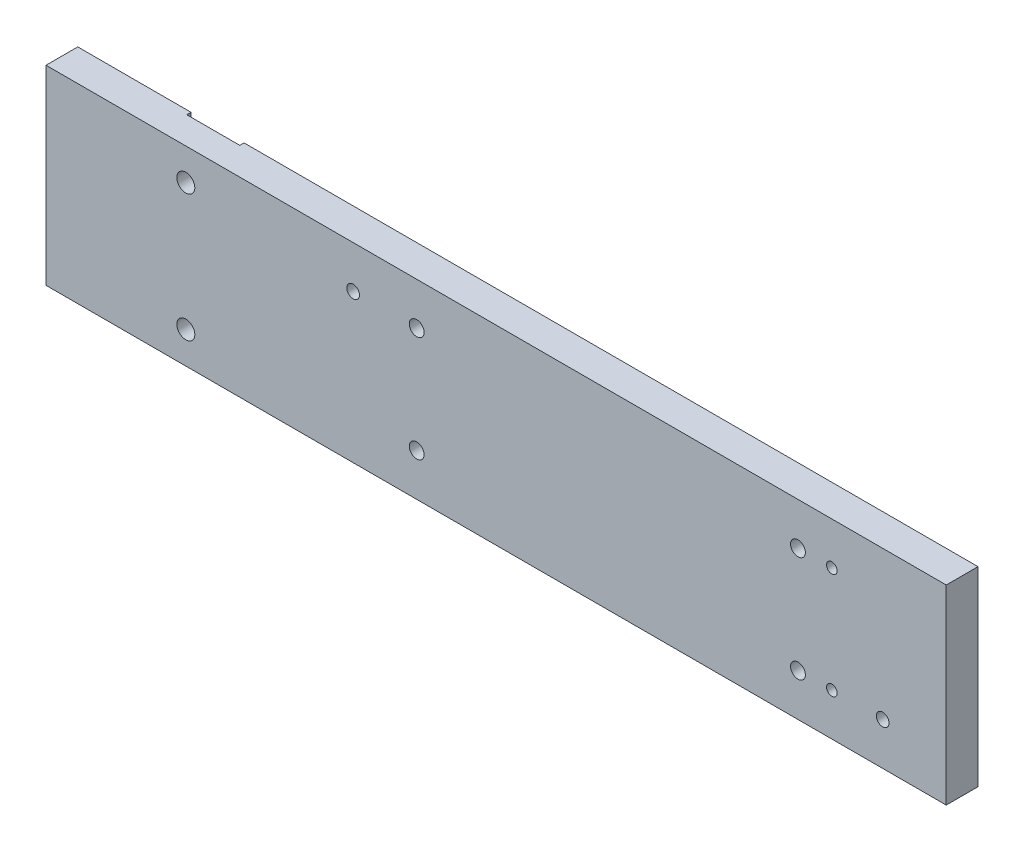
ISO-10303-21;
HEADER;
FILE_DESCRIPTION(('STEP AP214'),'2;1');
FILE_NAME('part.step','',(''),(''),'','','');
FILE_SCHEMA(('AUTOMOTIVE_DESIGN { 1 0 10303 214 1 1 1 1 }'));
ENDSEC;
DATA;
#1=APPLICATION_CONTEXT('core data for automotive mechanical design processes');
#2=APPLICATION_PROTOCOL_DEFINITION('international standard','automotive_design',2000,#1);
#3=PRODUCT_CONTEXT('',#1,'mechanical');
#4=PRODUCT('Part','Part','',(#3));
#5=PRODUCT_RELATED_PRODUCT_CATEGORY('part','',(#4));
#6=PRODUCT_DEFINITION_FORMATION('','',#4);
#7=PRODUCT_DEFINITION_CONTEXT('part definition',#1,'design');
#8=PRODUCT_DEFINITION('design','',#6,#7);
#9=PRODUCT_DEFINITION_SHAPE('','',#8);
#10=(LENGTH_UNIT() NAMED_UNIT(*) SI_UNIT(.MILLI.,.METRE.));
#11=(NAMED_UNIT(*) PLANE_ANGLE_UNIT() SI_UNIT($,.RADIAN.));
#12=(NAMED_UNIT(*) SI_UNIT($,.STERADIAN.) SOLID_ANGLE_UNIT());
#13=UNCERTAINTY_MEASURE_WITH_UNIT(LENGTH_MEASURE(1.E-05),#10,'distance_accuracy_value','');
#14=(GEOMETRIC_REPRESENTATION_CONTEXT(3) GLOBAL_UNCERTAINTY_ASSIGNED_CONTEXT((#13)) GLOBAL_UNIT_ASSIGNED_CONTEXT((#10,
#11,#12)) REPRESENTATION_CONTEXT('',''));
#15=CARTESIAN_POINT('',(0.,0.,0.));
#16=DIRECTION('',(0.,0.,1.));
#17=DIRECTION('',(1.,0.,0.));
#18=AXIS2_PLACEMENT_3D('',#15,#16,#17);
#19=CARTESIAN_POINT('',(0.,90.,0.));
#20=DIRECTION('',(0.,0.,-1.));
#21=DIRECTION('',(-1.,0.,0.));
#22=AXIS2_PLACEMENT_3D('',#19,#20,#21);
#23=PLANE('',#22);
#24=DIRECTION('',(0.,1.,0.));
#25=VECTOR('',#24,1.);
#26=CARTESIAN_POINT('',(53.5,0.,0.));
#27=LINE('',#26,#25);
#28=CARTESIAN_POINT('',(53.5,0.,0.));
#29=VERTEX_POINT('',#28);
#30=CARTESIAN_POINT('',(53.5,90.,0.));
#31=VERTEX_POINT('',#30);
#32=EDGE_CURVE('E183',#29,#31,#27,.T.);
#33=ORIENTED_EDGE('',*,*,#32,.F.);
#34=DIRECTION('',(1.,0.,0.));
#35=VECTOR('',#34,1.);
#36=CARTESIAN_POINT('',(0.,0.,0.));
#37=LINE('',#36,#35);
#38=CARTESIAN_POINT('',(0.,0.,0.));
#39=VERTEX_POINT('',#38);
#40=EDGE_CURVE('E202',#39,#29,#37,.T.);
#41=ORIENTED_EDGE('',*,*,#40,.F.);
#42=DIRECTION('',(0.,-1.,0.));
#43=VECTOR('',#42,1.);
#44=CARTESIAN_POINT('',(0.,0.,0.));
#45=LINE('',#44,#43);
#46=CARTESIAN_POINT('',(0.,90.,0.));
#47=VERTEX_POINT('',#46);
#48=EDGE_CURVE('E185',#47,#39,#45,.T.);
#49=ORIENTED_EDGE('',*,*,#48,.F.);
#50=DIRECTION('',(-1.,0.,0.));
#51=VECTOR('',#50,1.);
#52=CARTESIAN_POINT('',(0.,90.,0.));
#53=LINE('',#52,#51);
#54=EDGE_CURVE('E80',#31,#47,#53,.T.);
#55=ORIENTED_EDGE('',*,*,#54,.F.);
#56=EDGE_LOOP('',(#33,#41,#49,#55));
#57=FACE_BOUND('',#56,.T.);
#58=ADVANCED_FACE('F35',(#57),#23,.T.);
#59=CARTESIAN_POINT('',(0.,0.,15.));
#60=DIRECTION('',(1.,0.,0.));
#61=DIRECTION('',(0.,0.,-1.));
#62=AXIS2_PLACEMENT_3D('',#59,#60,#61);
#63=PLANE('',#62);
#64=CARTESIAN_POINT('',(0.,68.0000000000001,7.5));
#65=DIRECTION('',(-1.,0.,0.));
#66=DIRECTION('',(0.,0.,1.));
#67=AXIS2_PLACEMENT_3D('',#64,#65,#66);
#68=CIRCLE('',#67,2.5);
#69=CARTESIAN_POINT('',(0.,68.0000000000001,10.));
#70=VERTEX_POINT('',#69);
#71=EDGE_CURVE('E142',#70,#70,#68,.T.);
#72=ORIENTED_EDGE('',*,*,#71,.F.);
#73=EDGE_LOOP('',(#72));
#74=FACE_BOUND('',#73,.T.);
#75=CARTESIAN_POINT('',(0.,22.,7.50000000000002));
#76=DIRECTION('',(-1.,0.,0.));
#77=DIRECTION('',(0.,0.,1.));
#78=AXIS2_PLACEMENT_3D('',#75,#76,#77);
#79=CIRCLE('',#78,2.5);
#80=CARTESIAN_POINT('',(0.,22.,10.));
#81=VERTEX_POINT('',#80);
#82=EDGE_CURVE('E148',#81,#81,#79,.T.);
#83=ORIENTED_EDGE('',*,*,#82,.F.);
#84=EDGE_LOOP('',(#83));
#85=FACE_BOUND('',#84,.T.);
#86=ORIENTED_EDGE('',*,*,#48,.T.);
#87=DIRECTION('',(0.,0.,-1.));
#88=VECTOR('',#87,1.);
#89=CARTESIAN_POINT('',(0.,0.,15.));
#90=LINE('',#89,#88);
#91=CARTESIAN_POINT('',(0.,0.,15.));
#92=VERTEX_POINT('',#91);
#93=EDGE_CURVE('E11',#92,#39,#90,.T.);
#94=ORIENTED_EDGE('',*,*,#93,.F.);
#95=DIRECTION('',(0.,-1.,0.));
#96=VECTOR('',#95,1.);
#97=CARTESIAN_POINT('',(0.,0.,15.));
#98=LINE('',#97,#96);
#99=CARTESIAN_POINT('',(0.,90.,15.));
#100=VERTEX_POINT('',#99);
#101=EDGE_CURVE('E191',#100,#92,#98,.T.);
#102=ORIENTED_EDGE('',*,*,#101,.F.);
#103=DIRECTION('',(0.,0.,-1.));
#104=VECTOR('',#103,1.);
#105=CARTESIAN_POINT('',(0.,90.,15.));
#106=LINE('',#105,#104);
#107=EDGE_CURVE('E198',#100,#47,#106,.T.);
#108=ORIENTED_EDGE('',*,*,#107,.T.);
#109=EDGE_LOOP('',(#86,#94,#102,#108));
#110=FACE_BOUND('',#109,.T.);
#111=ADVANCED_FACE('F37',(#74,#85,#110),#63,.F.);
#112=CARTESIAN_POINT('',(0.,0.,15.));
#113=DIRECTION('',(0.,1.,0.));
#114=DIRECTION('',(0.,0.,1.));
#115=AXIS2_PLACEMENT_3D('',#112,#113,#114);
#116=PLANE('',#115);
#117=CARTESIAN_POINT('',(8.99999999999905,0.,8.00000000000002));
#118=DIRECTION('',(0.,-1.,0.));
#119=DIRECTION('',(0.,0.,-1.));
#120=AXIS2_PLACEMENT_3D('',#117,#118,#119);
#121=CIRCLE('',#120,2.1);
#122=CARTESIAN_POINT('',(8.99999999999905,0.,5.90000000000002));
#123=VERTEX_POINT('',#122);
#124=EDGE_CURVE('E130',#123,#123,#121,.T.);
#125=ORIENTED_EDGE('',*,*,#124,.F.);
#126=EDGE_LOOP('',(#125));
#127=FACE_BOUND('',#126,.T.);
#128=CARTESIAN_POINT('',(43.9999999999991,0.,8.00000000000001));
#129=DIRECTION('',(0.,-1.,0.));
#130=DIRECTION('',(0.,0.,-1.));
#131=AXIS2_PLACEMENT_3D('',#128,#129,#130);
#132=CIRCLE('',#131,2.1);
#133=CARTESIAN_POINT('',(43.9999999999991,0.,5.90000000000002));
#134=VERTEX_POINT('',#133);
#135=EDGE_CURVE('E129',#134,#134,#132,.T.);
#136=ORIENTED_EDGE('',*,*,#135,.F.);
#137=EDGE_LOOP('',(#136));
#138=FACE_BOUND('',#137,.T.);
#139=ORIENTED_EDGE('',*,*,#40,.T.);
#140=DIRECTION('',(0.,0.,1.));
#141=VECTOR('',#140,1.);
#142=CARTESIAN_POINT('',(53.5,0.,0.));
#143=LINE('',#142,#141);
#144=CARTESIAN_POINT('',(53.5,0.,2.));
#145=VERTEX_POINT('',#144);
#146=EDGE_CURVE('E167',#29,#145,#143,.T.);
#147=ORIENTED_EDGE('',*,*,#146,.T.);
#148=DIRECTION('',(1.,0.,0.));
#149=VECTOR('',#148,1.);
#150=CARTESIAN_POINT('',(53.5,0.,2.));
#151=LINE('',#150,#149);
#152=CARTESIAN_POINT('',(78.5,0.,2.));
#153=VERTEX_POINT('',#152);
#154=EDGE_CURVE('E170',#145,#153,#151,.T.);
#155=ORIENTED_EDGE('',*,*,#154,.T.);
#156=DIRECTION('',(0.,0.,-1.));
#157=VECTOR('',#156,1.);
#158=CARTESIAN_POINT('',(78.5,0.,0.));
#159=LINE('',#158,#157);
#160=CARTESIAN_POINT('',(78.5,0.,0.));
#161=VERTEX_POINT('',#160);
#162=EDGE_CURVE('E173',#153,#161,#159,.T.);
#163=ORIENTED_EDGE('',*,*,#162,.T.);
#164=CARTESIAN_POINT('',(425.,0.,0.));
#165=VERTEX_POINT('',#164);
#166=EDGE_CURVE('E201',#161,#165,#37,.T.);
#167=ORIENTED_EDGE('',*,*,#166,.T.);
#168=DIRECTION('',(0.,0.,-1.));
#169=VECTOR('',#168,1.);
#170=CARTESIAN_POINT('',(425.,0.,15.));
#171=LINE('',#170,#169);
#172=CARTESIAN_POINT('',(425.,0.,15.));
#173=VERTEX_POINT('',#172);
#174=EDGE_CURVE('E43',#173,#165,#171,.T.);
#175=ORIENTED_EDGE('',*,*,#174,.F.);
#176=DIRECTION('',(1.,0.,0.));
#177=VECTOR('',#176,1.);
#178=CARTESIAN_POINT('',(0.,0.,15.));
#179=LINE('',#178,#177);
#180=EDGE_CURVE('E87',#92,#173,#179,.T.);
#181=ORIENTED_EDGE('',*,*,#180,.F.);
#182=ORIENTED_EDGE('',*,*,#93,.T.);
#183=EDGE_LOOP('',(#139,#147,#155,#163,#167,#175,#181,#182));
#184=FACE_BOUND('',#183,.T.);
#185=ADVANCED_FACE('F250',(#127,#138,#184),#116,.F.);
#186=CARTESIAN_POINT('',(425.,0.,15.));
#187=DIRECTION('',(-1.,0.,0.));
#188=DIRECTION('',(0.,0.,1.));
#189=AXIS2_PLACEMENT_3D('',#186,#187,#188);
#190=PLANE('',#189);
#191=DIRECTION('',(0.,1.,0.));
#192=VECTOR('',#191,1.);
#193=CARTESIAN_POINT('',(425.,0.,0.));
#194=LINE('',#193,#192);
#195=CARTESIAN_POINT('',(425.,90.,0.));
#196=VERTEX_POINT('',#195);
#197=EDGE_CURVE('E205',#165,#196,#194,.T.);
#198=ORIENTED_EDGE('',*,*,#197,.T.);
#199=DIRECTION('',(0.,0.,-1.));
#200=VECTOR('',#199,1.);
#201=CARTESIAN_POINT('',(425.,90.,15.));
#202=LINE('',#201,#200);
#203=CARTESIAN_POINT('',(425.,90.,15.));
#204=VERTEX_POINT('',#203);
#205=EDGE_CURVE('E210',#204,#196,#202,.T.);
#206=ORIENTED_EDGE('',*,*,#205,.F.);
#207=DIRECTION('',(0.,1.,0.));
#208=VECTOR('',#207,1.);
#209=CARTESIAN_POINT('',(425.,0.,15.));
#210=LINE('',#209,#208);
#211=EDGE_CURVE('E195',#173,#204,#210,.T.);
#212=ORIENTED_EDGE('',*,*,#211,.F.);
#213=ORIENTED_EDGE('',*,*,#174,.T.);
#214=EDGE_LOOP('',(#198,#206,#212,#213));
#215=FACE_BOUND('',#214,.T.);
#216=ADVANCED_FACE('F216',(#215),#190,.F.);
#217=CARTESIAN_POINT('',(0.,90.,15.));
#218=DIRECTION('',(0.,-1.,0.));
#219=DIRECTION('',(0.,0.,-1.));
#220=AXIS2_PLACEMENT_3D('',#217,#218,#219);
#221=PLANE('',#220);
#222=DIRECTION('',(1.,0.,0.));
#223=VECTOR('',#222,1.);
#224=CARTESIAN_POINT('',(53.5,90.,2.));
#225=LINE('',#224,#223);
#226=CARTESIAN_POINT('',(53.5,90.,2.));
#227=VERTEX_POINT('',#226);
#228=CARTESIAN_POINT('',(78.5,90.,2.));
#229=VERTEX_POINT('',#228);
#230=EDGE_CURVE('E179',#227,#229,#225,.T.);
#231=ORIENTED_EDGE('',*,*,#230,.F.);
#232=DIRECTION('',(0.,0.,1.));
#233=VECTOR('',#232,1.);
#234=CARTESIAN_POINT('',(53.5,90.,0.));
#235=LINE('',#234,#233);
#236=EDGE_CURVE('E166',#31,#227,#235,.T.);
#237=ORIENTED_EDGE('',*,*,#236,.F.);
#238=ORIENTED_EDGE('',*,*,#54,.T.);
#239=ORIENTED_EDGE('',*,*,#107,.F.);
#240=DIRECTION('',(-1.,0.,0.));
#241=VECTOR('',#240,1.);
#242=CARTESIAN_POINT('',(0.,90.,15.));
#243=LINE('',#242,#241);
#244=EDGE_CURVE('E59',#204,#100,#243,.T.);
#245=ORIENTED_EDGE('',*,*,#244,.F.);
#246=ORIENTED_EDGE('',*,*,#205,.T.);
#247=CARTESIAN_POINT('',(78.5,90.,0.));
#248=VERTEX_POINT('',#247);
#249=EDGE_CURVE('E193',#196,#248,#53,.T.);
#250=ORIENTED_EDGE('',*,*,#249,.T.);
#251=DIRECTION('',(0.,0.,-1.));
#252=VECTOR('',#251,1.);
#253=CARTESIAN_POINT('',(78.5,90.,0.));
#254=LINE('',#253,#252);
#255=EDGE_CURVE('E50',#229,#248,#254,.T.);
#256=ORIENTED_EDGE('',*,*,#255,.F.);
#257=EDGE_LOOP('',(#231,#237,#238,#239,#245,#246,#250,#256));
#258=FACE_BOUND('',#257,.T.);
#259=ADVANCED_FACE('F223',(#258),#221,.F.);
#260=CARTESIAN_POINT('',(0.,90.,15.));
#261=DIRECTION('',(0.,0.,-1.));
#262=DIRECTION('',(-1.,0.,0.));
#263=AXIS2_PLACEMENT_3D('',#260,#261,#262);
#264=PLANE('',#263);
#265=CARTESIAN_POINT('',(175.,20.,15.));
#266=DIRECTION('',(0.,0.,-1.));
#267=DIRECTION('',(-1.,0.,0.));
#268=AXIS2_PLACEMENT_3D('',#265,#266,#267);
#269=CIRCLE('',#268,3.5);
#270=CARTESIAN_POINT('',(171.5,20.,15.));
#271=VERTEX_POINT('',#270);
#272=EDGE_CURVE('E391',#271,#271,#269,.T.);
#273=ORIENTED_EDGE('',*,*,#272,.T.);
#274=EDGE_LOOP('',(#273));
#275=FACE_BOUND('',#274,.T.);
#276=CARTESIAN_POINT('',(355.,20.,15.));
#277=DIRECTION('',(0.,0.,-1.));
#278=DIRECTION('',(-1.,0.,0.));
#279=AXIS2_PLACEMENT_3D('',#276,#277,#278);
#280=CIRCLE('',#279,3.5);
#281=CARTESIAN_POINT('',(351.5,20.,15.));
#282=VERTEX_POINT('',#281);
#283=EDGE_CURVE('E402',#282,#282,#280,.T.);
#284=ORIENTED_EDGE('',*,*,#283,.T.);
#285=EDGE_LOOP('',(#284));
#286=FACE_BOUND('',#285,.T.);
#287=CARTESIAN_POINT('',(175.,70.,15.));
#288=DIRECTION('',(0.,0.,-1.));
#289=DIRECTION('',(-1.,0.,0.));
#290=AXIS2_PLACEMENT_3D('',#287,#288,#289);
#291=CIRCLE('',#290,3.5);
#292=CARTESIAN_POINT('',(171.5,70.,15.));
#293=VERTEX_POINT('',#292);
#294=EDGE_CURVE('E414',#293,#293,#291,.T.);
#295=ORIENTED_EDGE('',*,*,#294,.T.);
#296=EDGE_LOOP('',(#295));
#297=FACE_BOUND('',#296,.T.);
#298=CARTESIAN_POINT('',(355.,70.,15.));
#299=DIRECTION('',(0.,0.,-1.));
#300=DIRECTION('',(-1.,0.,0.));
#301=AXIS2_PLACEMENT_3D('',#298,#299,#300);
#302=CIRCLE('',#301,3.5);
#303=CARTESIAN_POINT('',(351.5,70.,15.));
#304=VERTEX_POINT('',#303);
#305=EDGE_CURVE('E426',#304,#304,#302,.T.);
#306=ORIENTED_EDGE('',*,*,#305,.T.);
#307=EDGE_LOOP('',(#306));
#308=FACE_BOUND('',#307,.T.);
#309=CARTESIAN_POINT('',(395.,20.,15.));
#310=DIRECTION('',(0.,0.,-1.));
#311=DIRECTION('',(-1.,0.,0.));
#312=AXIS2_PLACEMENT_3D('',#309,#310,#311);
#313=CIRCLE('',#312,2.99999999999999);
#314=CARTESIAN_POINT('',(392.,20.,15.));
#315=VERTEX_POINT('',#314);
#316=EDGE_CURVE('E430',#315,#315,#313,.T.);
#317=ORIENTED_EDGE('',*,*,#316,.T.);
#318=EDGE_LOOP('',(#317));
#319=FACE_BOUND('',#318,.T.);
#320=CARTESIAN_POINT('',(145.,70.,15.));
#321=DIRECTION('',(0.,0.,-1.));
#322=DIRECTION('',(-1.,0.,0.));
#323=AXIS2_PLACEMENT_3D('',#320,#321,#322);
#324=CIRCLE('',#323,2.99999999999999);
#325=CARTESIAN_POINT('',(142.,70.,15.));
#326=VERTEX_POINT('',#325);
#327=EDGE_CURVE('E436',#326,#326,#324,.T.);
#328=ORIENTED_EDGE('',*,*,#327,.T.);
#329=EDGE_LOOP('',(#328));
#330=FACE_BOUND('',#329,.T.);
#331=CARTESIAN_POINT('',(371.,70.,15.));
#332=DIRECTION('',(0.,0.,-1.));
#333=DIRECTION('',(-1.,0.,0.));
#334=AXIS2_PLACEMENT_3D('',#331,#332,#333);
#335=CIRCLE('',#334,2.5);
#336=CARTESIAN_POINT('',(368.5,70.,15.));
#337=VERTEX_POINT('',#336);
#338=EDGE_CURVE('E444',#337,#337,#335,.T.);
#339=ORIENTED_EDGE('',*,*,#338,.T.);
#340=EDGE_LOOP('',(#339));
#341=FACE_BOUND('',#340,.T.);
#342=CARTESIAN_POINT('',(371.,20.,15.));
#343=DIRECTION('',(0.,0.,-1.));
#344=DIRECTION('',(-1.,0.,0.));
#345=AXIS2_PLACEMENT_3D('',#342,#343,#344);
#346=CIRCLE('',#345,2.5);
#347=CARTESIAN_POINT('',(368.5,20.,15.));
#348=VERTEX_POINT('',#347);
#349=EDGE_CURVE('E136',#348,#348,#346,.T.);
#350=ORIENTED_EDGE('',*,*,#349,.T.);
#351=EDGE_LOOP('',(#350));
#352=FACE_BOUND('',#351,.T.);
#353=CARTESIAN_POINT('',(65.9999999999998,75.,15.));
#354=DIRECTION('',(0.,0.,-1.));
#355=DIRECTION('',(-1.,0.,0.));
#356=AXIS2_PLACEMENT_3D('',#353,#354,#355);
#357=CIRCLE('',#356,4.25);
#358=CARTESIAN_POINT('',(61.7499999999998,75.,15.));
#359=VERTEX_POINT('',#358);
#360=EDGE_CURVE('E157',#359,#359,#357,.T.);
#361=ORIENTED_EDGE('',*,*,#360,.T.);
#362=EDGE_LOOP('',(#361));
#363=FACE_BOUND('',#362,.T.);
#364=CARTESIAN_POINT('',(65.9999999999998,14.9999999999999,15.));
#365=DIRECTION('',(0.,0.,-1.));
#366=DIRECTION('',(-1.,0.,0.));
#367=AXIS2_PLACEMENT_3D('',#364,#365,#366);
#368=CIRCLE('',#367,4.25);
#369=CARTESIAN_POINT('',(61.7499999999998,14.9999999999999,15.));
#370=VERTEX_POINT('',#369);
#371=EDGE_CURVE('E163',#370,#370,#368,.T.);
#372=ORIENTED_EDGE('',*,*,#371,.T.);
#373=EDGE_LOOP('',(#372));
#374=FACE_BOUND('',#373,.T.);
#375=ORIENTED_EDGE('',*,*,#101,.T.);
#376=ORIENTED_EDGE('',*,*,#180,.T.);
#377=ORIENTED_EDGE('',*,*,#211,.T.);
#378=ORIENTED_EDGE('',*,*,#244,.T.);
#379=EDGE_LOOP('',(#375,#376,#377,#378));
#380=FACE_BOUND('',#379,.T.);
#381=ADVANCED_FACE('F228',(#275,#286,#297,#308,#319,#330,#341,#352,#363,#374,#380),#264,.F.);
#382=CARTESIAN_POINT('',(175.,20.,0.));
#383=DIRECTION('',(0.,0.,-1.));
#384=DIRECTION('',(-1.,0.,0.));
#385=AXIS2_PLACEMENT_3D('',#382,#383,#384);
#386=CIRCLE('',#385,5.50000000000001);
#387=CARTESIAN_POINT('',(169.5,20.,0.));
#388=VERTEX_POINT('',#387);
#389=EDGE_CURVE('E384',#388,#388,#386,.T.);
#390=ORIENTED_EDGE('',*,*,#389,.F.);
#391=EDGE_LOOP('',(#390));
#392=FACE_BOUND('',#391,.T.);
#393=CARTESIAN_POINT('',(355.,20.,0.));
#394=DIRECTION('',(0.,0.,-1.));
#395=DIRECTION('',(-1.,0.,0.));
#396=AXIS2_PLACEMENT_3D('',#393,#394,#395);
#397=CIRCLE('',#396,5.50000000000001);
#398=CARTESIAN_POINT('',(349.5,20.,0.));
#399=VERTEX_POINT('',#398);
#400=EDGE_CURVE('E393',#399,#399,#397,.T.);
#401=ORIENTED_EDGE('',*,*,#400,.F.);
#402=EDGE_LOOP('',(#401));
#403=FACE_BOUND('',#402,.T.);
#404=CARTESIAN_POINT('',(175.,70.,0.));
#405=DIRECTION('',(0.,0.,-1.));
#406=DIRECTION('',(-1.,0.,0.));
#407=AXIS2_PLACEMENT_3D('',#404,#405,#406);
#408=CIRCLE('',#407,5.50000000000001);
#409=CARTESIAN_POINT('',(169.5,70.,0.));
#410=VERTEX_POINT('',#409);
#411=EDGE_CURVE('E405',#410,#410,#408,.T.);
#412=ORIENTED_EDGE('',*,*,#411,.F.);
#413=EDGE_LOOP('',(#412));
#414=FACE_BOUND('',#413,.T.);
#415=CARTESIAN_POINT('',(355.,70.,0.));
#416=DIRECTION('',(0.,0.,-1.));
#417=DIRECTION('',(-1.,0.,0.));
#418=AXIS2_PLACEMENT_3D('',#415,#416,#417);
#419=CIRCLE('',#418,5.50000000000001);
#420=CARTESIAN_POINT('',(349.5,70.,0.));
#421=VERTEX_POINT('',#420);
#422=EDGE_CURVE('E417',#421,#421,#419,.T.);
#423=ORIENTED_EDGE('',*,*,#422,.F.);
#424=EDGE_LOOP('',(#423));
#425=FACE_BOUND('',#424,.T.);
#426=CARTESIAN_POINT('',(395.,20.,0.));
#427=DIRECTION('',(0.,0.,-1.));
#428=DIRECTION('',(-1.,0.,0.));
#429=AXIS2_PLACEMENT_3D('',#426,#427,#428);
#430=CIRCLE('',#429,2.99999999999999);
#431=CARTESIAN_POINT('',(392.,20.,0.));
#432=VERTEX_POINT('',#431);
#433=EDGE_CURVE('E429',#432,#432,#430,.T.);
#434=ORIENTED_EDGE('',*,*,#433,.F.);
#435=EDGE_LOOP('',(#434));
#436=FACE_BOUND('',#435,.T.);
#437=CARTESIAN_POINT('',(145.,70.,0.));
#438=DIRECTION('',(0.,0.,-1.));
#439=DIRECTION('',(-1.,0.,0.));
#440=AXIS2_PLACEMENT_3D('',#437,#438,#439);
#441=CIRCLE('',#440,2.99999999999999);
#442=CARTESIAN_POINT('',(142.,70.,0.));
#443=VERTEX_POINT('',#442);
#444=EDGE_CURVE('E433',#443,#443,#441,.T.);
#445=ORIENTED_EDGE('',*,*,#444,.F.);
#446=EDGE_LOOP('',(#445));
#447=FACE_BOUND('',#446,.T.);
#448=CARTESIAN_POINT('',(371.,70.,0.));
#449=DIRECTION('',(0.,0.,-1.));
#450=DIRECTION('',(-1.,0.,0.));
#451=AXIS2_PLACEMENT_3D('',#448,#449,#450);
#452=CIRCLE('',#451,2.5);
#453=CARTESIAN_POINT('',(368.5,70.,0.));
#454=VERTEX_POINT('',#453);
#455=EDGE_CURVE('E439',#454,#454,#452,.T.);
#456=ORIENTED_EDGE('',*,*,#455,.F.);
#457=EDGE_LOOP('',(#456));
#458=FACE_BOUND('',#457,.T.);
#459=CARTESIAN_POINT('',(371.,20.,0.));
#460=DIRECTION('',(0.,0.,-1.));
#461=DIRECTION('',(-1.,0.,0.));
#462=AXIS2_PLACEMENT_3D('',#459,#460,#461);
#463=CIRCLE('',#462,2.5);
#464=CARTESIAN_POINT('',(368.5,20.,0.));
#465=VERTEX_POINT('',#464);
#466=EDGE_CURVE('E447',#465,#465,#463,.T.);
#467=ORIENTED_EDGE('',*,*,#466,.F.);
#468=EDGE_LOOP('',(#467));
#469=FACE_BOUND('',#468,.T.);
#470=DIRECTION('',(0.,1.,0.));
#471=VECTOR('',#470,1.);
#472=CARTESIAN_POINT('',(78.5,0.,0.));
#473=LINE('',#472,#471);
#474=EDGE_CURVE('E186',#161,#248,#473,.T.);
#475=ORIENTED_EDGE('',*,*,#474,.T.);
#476=ORIENTED_EDGE('',*,*,#249,.F.);
#477=ORIENTED_EDGE('',*,*,#197,.F.);
#478=ORIENTED_EDGE('',*,*,#166,.F.);
#479=EDGE_LOOP('',(#475,#476,#477,#478));
#480=FACE_BOUND('',#479,.T.);
#481=ADVANCED_FACE('F221',(#392,#403,#414,#425,#436,#447,#458,#469,#480),#23,.T.);
#482=CARTESIAN_POINT('',(53.5,0.,0.));
#483=DIRECTION('',(-1.,0.,0.));
#484=DIRECTION('',(0.,0.,1.));
#485=AXIS2_PLACEMENT_3D('',#482,#483,#484);
#486=PLANE('',#485);
#487=ORIENTED_EDGE('',*,*,#236,.T.);
#488=DIRECTION('',(0.,1.,0.));
#489=VECTOR('',#488,1.);
#490=CARTESIAN_POINT('',(53.5,0.,2.));
#491=LINE('',#490,#489);
#492=EDGE_CURVE('E176',#145,#227,#491,.T.);
#493=ORIENTED_EDGE('',*,*,#492,.F.);
#494=ORIENTED_EDGE('',*,*,#146,.F.);
#495=ORIENTED_EDGE('',*,*,#32,.T.);
#496=EDGE_LOOP('',(#487,#493,#494,#495));
#497=FACE_BOUND('',#496,.T.);
#498=ADVANCED_FACE('F236',(#497),#486,.F.);
#499=CARTESIAN_POINT('',(78.5,0.,0.));
#500=DIRECTION('',(1.,0.,0.));
#501=DIRECTION('',(0.,0.,-1.));
#502=AXIS2_PLACEMENT_3D('',#499,#500,#501);
#503=PLANE('',#502);
#504=ORIENTED_EDGE('',*,*,#255,.T.);
#505=ORIENTED_EDGE('',*,*,#474,.F.);
#506=ORIENTED_EDGE('',*,*,#162,.F.);
#507=DIRECTION('',(0.,1.,0.));
#508=VECTOR('',#507,1.);
#509=CARTESIAN_POINT('',(78.5,0.,2.));
#510=LINE('',#509,#508);
#511=EDGE_CURVE('E188',#153,#229,#510,.T.);
#512=ORIENTED_EDGE('',*,*,#511,.T.);
#513=EDGE_LOOP('',(#504,#505,#506,#512));
#514=FACE_BOUND('',#513,.T.);
#515=ADVANCED_FACE('F269',(#514),#503,.F.);
#516=CARTESIAN_POINT('',(53.5,0.,2.));
#517=DIRECTION('',(0.,0.,1.));
#518=DIRECTION('',(1.,0.,0.));
#519=AXIS2_PLACEMENT_3D('',#516,#517,#518);
#520=PLANE('',#519);
#521=CARTESIAN_POINT('',(65.9999999999998,75.,2.));
#522=DIRECTION('',(0.,0.,-1.));
#523=DIRECTION('',(-1.,0.,0.));
#524=AXIS2_PLACEMENT_3D('',#521,#522,#523);
#525=CIRCLE('',#524,4.25);
#526=CARTESIAN_POINT('',(61.7499999999998,75.,2.));
#527=VERTEX_POINT('',#526);
#528=EDGE_CURVE('E154',#527,#527,#525,.T.);
#529=ORIENTED_EDGE('',*,*,#528,.F.);
#530=EDGE_LOOP('',(#529));
#531=FACE_BOUND('',#530,.T.);
#532=CARTESIAN_POINT('',(65.9999999999998,14.9999999999999,2.));
#533=DIRECTION('',(0.,0.,-1.));
#534=DIRECTION('',(-1.,0.,0.));
#535=AXIS2_PLACEMENT_3D('',#532,#533,#534);
#536=CIRCLE('',#535,4.25);
#537=CARTESIAN_POINT('',(61.7499999999998,14.9999999999999,2.));
#538=VERTEX_POINT('',#537);
#539=EDGE_CURVE('E160',#538,#538,#536,.T.);
#540=ORIENTED_EDGE('',*,*,#539,.F.);
#541=EDGE_LOOP('',(#540));
#542=FACE_BOUND('',#541,.T.);
#543=ORIENTED_EDGE('',*,*,#230,.T.);
#544=ORIENTED_EDGE('',*,*,#511,.F.);
#545=ORIENTED_EDGE('',*,*,#154,.F.);
#546=ORIENTED_EDGE('',*,*,#492,.T.);
#547=EDGE_LOOP('',(#543,#544,#545,#546));
#548=FACE_BOUND('',#547,.T.);
#549=ADVANCED_FACE('F266',(#531,#542,#548),#520,.F.);
#550=CARTESIAN_POINT('',(65.9999999999998,14.9999999999999,2.));
#551=DIRECTION('',(0.,0.,-1.));
#552=DIRECTION('',(-1.,0.,0.));
#553=AXIS2_PLACEMENT_3D('',#550,#551,#552);
#554=CYLINDRICAL_SURFACE('',#553,4.25);
#555=ORIENTED_EDGE('',*,*,#539,.T.);
#556=EDGE_LOOP('',(#555));
#557=FACE_BOUND('',#556,.T.);
#558=ORIENTED_EDGE('',*,*,#371,.F.);
#559=EDGE_LOOP('',(#558));
#560=FACE_BOUND('',#559,.T.);
#561=ADVANCED_FACE('F277',(#557,#560),#554,.F.);
#562=CARTESIAN_POINT('',(65.9999999999998,75.,2.));
#563=DIRECTION('',(0.,0.,-1.));
#564=DIRECTION('',(-1.,0.,0.));
#565=AXIS2_PLACEMENT_3D('',#562,#563,#564);
#566=CYLINDRICAL_SURFACE('',#565,4.25);
#567=ORIENTED_EDGE('',*,*,#528,.T.);
#568=EDGE_LOOP('',(#567));
#569=FACE_BOUND('',#568,.T.);
#570=ORIENTED_EDGE('',*,*,#360,.F.);
#571=EDGE_LOOP('',(#570));
#572=FACE_BOUND('',#571,.T.);
#573=ADVANCED_FACE('F283',(#569,#572),#566,.F.);
#574=CARTESIAN_POINT('',(15.,22.,7.50000000000002));
#575=DIRECTION('',(-1.,0.,0.));
#576=DIRECTION('',(0.,0.,1.));
#577=AXIS2_PLACEMENT_3D('',#574,#575,#576);
#578=CONICAL_SURFACE('',#577,2.5,1.02974425867665);
#579=CARTESIAN_POINT('',(16.5021515475689,22.,7.50000000000002));
#580=VERTEX_POINT('',#579);
#581=VERTEX_LOOP('',#580);
#582=FACE_BOUND('',#581,.T.);
#583=CARTESIAN_POINT('',(15.,22.,7.50000000000002));
#584=DIRECTION('',(-1.,0.,0.));
#585=DIRECTION('',(0.,0.,1.));
#586=AXIS2_PLACEMENT_3D('',#583,#584,#585);
#587=CIRCLE('',#586,2.5);
#588=CARTESIAN_POINT('',(15.,22.,10.));
#589=VERTEX_POINT('',#588);
#590=EDGE_CURVE('E151',#589,#589,#587,.T.);
#591=ORIENTED_EDGE('',*,*,#590,.T.);
#592=EDGE_LOOP('',(#591));
#593=FACE_BOUND('',#592,.T.);
#594=ADVANCED_FACE('F287',(#582,#593),#578,.F.);
#595=CARTESIAN_POINT('',(0.,22.,7.50000000000002));
#596=DIRECTION('',(-1.,0.,0.));
#597=DIRECTION('',(0.,0.,1.));
#598=AXIS2_PLACEMENT_3D('',#595,#596,#597);
#599=CYLINDRICAL_SURFACE('',#598,2.5);
#600=ORIENTED_EDGE('',*,*,#590,.F.);
#601=EDGE_LOOP('',(#600));
#602=FACE_BOUND('',#601,.T.);
#603=ORIENTED_EDGE('',*,*,#82,.T.);
#604=EDGE_LOOP('',(#603));
#605=FACE_BOUND('',#604,.T.);
#606=ADVANCED_FACE('F291',(#602,#605),#599,.F.);
#607=CARTESIAN_POINT('',(15.,68.0000000000001,7.5));
#608=DIRECTION('',(-1.,0.,0.));
#609=DIRECTION('',(0.,0.,1.));
#610=AXIS2_PLACEMENT_3D('',#607,#608,#609);
#611=CONICAL_SURFACE('',#610,2.5,1.02974425867666);
#612=CARTESIAN_POINT('',(16.5021515475689,68.0000000000001,7.5));
#613=VERTEX_POINT('',#612);
#614=VERTEX_LOOP('',#613);
#615=FACE_BOUND('',#614,.T.);
#616=CARTESIAN_POINT('',(15.,68.0000000000001,7.5));
#617=DIRECTION('',(-1.,0.,0.));
#618=DIRECTION('',(0.,0.,1.));
#619=AXIS2_PLACEMENT_3D('',#616,#617,#618);
#620=CIRCLE('',#619,2.5);
#621=CARTESIAN_POINT('',(15.,68.0000000000001,10.));
#622=VERTEX_POINT('',#621);
#623=EDGE_CURVE('E145',#622,#622,#620,.T.);
#624=ORIENTED_EDGE('',*,*,#623,.T.);
#625=EDGE_LOOP('',(#624));
#626=FACE_BOUND('',#625,.T.);
#627=ADVANCED_FACE('F295',(#615,#626),#611,.F.);
#628=CARTESIAN_POINT('',(0.,68.0000000000001,7.5));
#629=DIRECTION('',(-1.,0.,0.));
#630=DIRECTION('',(0.,0.,1.));
#631=AXIS2_PLACEMENT_3D('',#628,#629,#630);
#632=CYLINDRICAL_SURFACE('',#631,2.5);
#633=ORIENTED_EDGE('',*,*,#623,.F.);
#634=EDGE_LOOP('',(#633));
#635=FACE_BOUND('',#634,.T.);
#636=ORIENTED_EDGE('',*,*,#71,.T.);
#637=EDGE_LOOP('',(#636));
#638=FACE_BOUND('',#637,.T.);
#639=ADVANCED_FACE('F299',(#635,#638),#632,.F.);
#640=CARTESIAN_POINT('',(43.9999999999991,12.4,8.00000000000001));
#641=DIRECTION('',(0.,-1.,0.));
#642=DIRECTION('',(0.,0.,-1.));
#643=AXIS2_PLACEMENT_3D('',#640,#641,#642);
#644=CONICAL_SURFACE('',#643,2.1,1.02974425867665);
#645=CARTESIAN_POINT('',(43.9999999999991,13.6618072999579,8.00000000000001));
#646=VERTEX_POINT('',#645);
#647=VERTEX_LOOP('',#646);
#648=FACE_BOUND('',#647,.T.);
#649=CARTESIAN_POINT('',(43.9999999999991,12.4,8.00000000000001));
#650=DIRECTION('',(0.,-1.,0.));
#651=DIRECTION('',(0.,0.,-1.));
#652=AXIS2_PLACEMENT_3D('',#649,#650,#651);
#653=CIRCLE('',#652,2.1);
#654=CARTESIAN_POINT('',(43.9999999999991,12.4,5.90000000000002));
#655=VERTEX_POINT('',#654);
#656=EDGE_CURVE('E133',#655,#655,#653,.T.);
#657=ORIENTED_EDGE('',*,*,#656,.T.);
#658=EDGE_LOOP('',(#657));
#659=FACE_BOUND('',#658,.T.);
#660=ADVANCED_FACE('F303',(#648,#659),#644,.F.);
#661=CARTESIAN_POINT('',(43.9999999999991,0.,8.00000000000001));
#662=DIRECTION('',(0.,-1.,0.));
#663=DIRECTION('',(0.,0.,-1.));
#664=AXIS2_PLACEMENT_3D('',#661,#662,#663);
#665=CYLINDRICAL_SURFACE('',#664,2.1);
#666=ORIENTED_EDGE('',*,*,#656,.F.);
#667=EDGE_LOOP('',(#666));
#668=FACE_BOUND('',#667,.T.);
#669=ORIENTED_EDGE('',*,*,#135,.T.);
#670=EDGE_LOOP('',(#669));
#671=FACE_BOUND('',#670,.T.);
#672=ADVANCED_FACE('F123',(#668,#671),#665,.F.);
#673=CARTESIAN_POINT('',(8.99999999999905,12.4,8.00000000000002));
#674=DIRECTION('',(0.,-1.,0.));
#675=DIRECTION('',(0.,0.,-1.));
#676=AXIS2_PLACEMENT_3D('',#673,#674,#675);
#677=CONICAL_SURFACE('',#676,2.1,1.02974425867665);
#678=CARTESIAN_POINT('',(8.99999999999905,13.6618072999579,8.00000000000002));
#679=VERTEX_POINT('',#678);
#680=VERTEX_LOOP('',#679);
#681=FACE_BOUND('',#680,.T.);
#682=CARTESIAN_POINT('',(8.99999999999905,12.4,8.00000000000002));
#683=DIRECTION('',(0.,-1.,0.));
#684=DIRECTION('',(0.,0.,-1.));
#685=AXIS2_PLACEMENT_3D('',#682,#683,#684);
#686=CIRCLE('',#685,2.1);
#687=CARTESIAN_POINT('',(8.99999999999905,12.4,5.90000000000002));
#688=VERTEX_POINT('',#687);
#689=EDGE_CURVE('E127',#688,#688,#686,.T.);
#690=ORIENTED_EDGE('',*,*,#689,.T.);
#691=EDGE_LOOP('',(#690));
#692=FACE_BOUND('',#691,.T.);
#693=ADVANCED_FACE('F119',(#681,#692),#677,.F.);
#694=CARTESIAN_POINT('',(8.99999999999905,0.,8.00000000000002));
#695=DIRECTION('',(0.,-1.,0.));
#696=DIRECTION('',(0.,0.,-1.));
#697=AXIS2_PLACEMENT_3D('',#694,#695,#696);
#698=CYLINDRICAL_SURFACE('',#697,2.1);
#699=ORIENTED_EDGE('',*,*,#689,.F.);
#700=EDGE_LOOP('',(#699));
#701=FACE_BOUND('',#700,.T.);
#702=ORIENTED_EDGE('',*,*,#124,.T.);
#703=EDGE_LOOP('',(#702));
#704=FACE_BOUND('',#703,.T.);
#705=ADVANCED_FACE('F122',(#701,#704),#698,.F.);
#706=CARTESIAN_POINT('',(371.,20.,0.));
#707=DIRECTION('',(0.,0.,-1.));
#708=DIRECTION('',(-1.,0.,0.));
#709=AXIS2_PLACEMENT_3D('',#706,#707,#708);
#710=CYLINDRICAL_SURFACE('',#709,2.5);
#711=ORIENTED_EDGE('',*,*,#349,.F.);
#712=EDGE_LOOP('',(#711));
#713=FACE_BOUND('',#712,.T.);
#714=ORIENTED_EDGE('',*,*,#466,.T.);
#715=EDGE_LOOP('',(#714));
#716=FACE_BOUND('',#715,.T.);
#717=ADVANCED_FACE('F313',(#713,#716),#710,.F.);
#718=CARTESIAN_POINT('',(371.,70.,0.));
#719=DIRECTION('',(0.,0.,-1.));
#720=DIRECTION('',(-1.,0.,0.));
#721=AXIS2_PLACEMENT_3D('',#718,#719,#720);
#722=CYLINDRICAL_SURFACE('',#721,2.5);
#723=ORIENTED_EDGE('',*,*,#338,.F.);
#724=EDGE_LOOP('',(#723));
#725=FACE_BOUND('',#724,.T.);
#726=ORIENTED_EDGE('',*,*,#455,.T.);
#727=EDGE_LOOP('',(#726));
#728=FACE_BOUND('',#727,.T.);
#729=ADVANCED_FACE('F316',(#725,#728),#722,.F.);
#730=CARTESIAN_POINT('',(145.,70.,15.));
#731=DIRECTION('',(0.,0.,-1.));
#732=DIRECTION('',(-1.,0.,0.));
#733=AXIS2_PLACEMENT_3D('',#730,#731,#732);
#734=CYLINDRICAL_SURFACE('',#733,2.99999999999999);
#735=ORIENTED_EDGE('',*,*,#327,.F.);
#736=EDGE_LOOP('',(#735));
#737=FACE_BOUND('',#736,.T.);
#738=ORIENTED_EDGE('',*,*,#444,.T.);
#739=EDGE_LOOP('',(#738));
#740=FACE_BOUND('',#739,.T.);
#741=ADVANCED_FACE('F320',(#737,#740),#734,.F.);
#742=CARTESIAN_POINT('',(395.,20.,15.));
#743=DIRECTION('',(0.,0.,-1.));
#744=DIRECTION('',(-1.,0.,0.));
#745=AXIS2_PLACEMENT_3D('',#742,#743,#744);
#746=CYLINDRICAL_SURFACE('',#745,2.99999999999999);
#747=ORIENTED_EDGE('',*,*,#316,.F.);
#748=EDGE_LOOP('',(#747));
#749=FACE_BOUND('',#748,.T.);
#750=ORIENTED_EDGE('',*,*,#433,.T.);
#751=EDGE_LOOP('',(#750));
#752=FACE_BOUND('',#751,.T.);
#753=ADVANCED_FACE('F324',(#749,#752),#746,.F.);
#754=CARTESIAN_POINT('',(355.,70.,0.));
#755=DIRECTION('',(0.,0.,-1.));
#756=DIRECTION('',(-1.,0.,0.));
#757=AXIS2_PLACEMENT_3D('',#754,#755,#756);
#758=CYLINDRICAL_SURFACE('',#757,3.5);
#759=ORIENTED_EDGE('',*,*,#305,.F.);
#760=EDGE_LOOP('',(#759));
#761=FACE_BOUND('',#760,.T.);
#762=CARTESIAN_POINT('',(355.,70.,6.));
#763=DIRECTION('',(0.,0.,-1.));
#764=DIRECTION('',(-1.,0.,0.));
#765=AXIS2_PLACEMENT_3D('',#762,#763,#764);
#766=CIRCLE('',#765,3.5);
#767=CARTESIAN_POINT('',(351.5,70.,6.));
#768=VERTEX_POINT('',#767);
#769=EDGE_CURVE('E423',#768,#768,#766,.T.);
#770=ORIENTED_EDGE('',*,*,#769,.T.);
#771=EDGE_LOOP('',(#770));
#772=FACE_BOUND('',#771,.T.);
#773=ADVANCED_FACE('F328',(#761,#772),#758,.F.);
#774=CARTESIAN_POINT('',(358.5,70.,6.));
#775=DIRECTION('',(0.,0.,1.));
#776=DIRECTION('',(1.,0.,0.));
#777=AXIS2_PLACEMENT_3D('',#774,#775,#776);
#778=PLANE('',#777);
#779=ORIENTED_EDGE('',*,*,#769,.F.);
#780=EDGE_LOOP('',(#779));
#781=FACE_BOUND('',#780,.T.);
#782=CARTESIAN_POINT('',(355.,70.,6.));
#783=DIRECTION('',(0.,0.,-1.));
#784=DIRECTION('',(-1.,0.,0.));
#785=AXIS2_PLACEMENT_3D('',#782,#783,#784);
#786=CIRCLE('',#785,5.50000000000001);
#787=CARTESIAN_POINT('',(349.5,70.,6.));
#788=VERTEX_POINT('',#787);
#789=EDGE_CURVE('E420',#788,#788,#786,.T.);
#790=ORIENTED_EDGE('',*,*,#789,.T.);
#791=EDGE_LOOP('',(#790));
#792=FACE_BOUND('',#791,.T.);
#793=ADVANCED_FACE('F332',(#781,#792),#778,.F.);
#794=CARTESIAN_POINT('',(355.,70.,0.));
#795=DIRECTION('',(0.,0.,-1.));
#796=DIRECTION('',(-1.,0.,0.));
#797=AXIS2_PLACEMENT_3D('',#794,#795,#796);
#798=CYLINDRICAL_SURFACE('',#797,5.50000000000001);
#799=ORIENTED_EDGE('',*,*,#789,.F.);
#800=EDGE_LOOP('',(#799));
#801=FACE_BOUND('',#800,.T.);
#802=ORIENTED_EDGE('',*,*,#422,.T.);
#803=EDGE_LOOP('',(#802));
#804=FACE_BOUND('',#803,.T.);
#805=ADVANCED_FACE('F336',(#801,#804),#798,.F.);
#806=CARTESIAN_POINT('',(175.,70.,0.));
#807=DIRECTION('',(0.,0.,-1.));
#808=DIRECTION('',(-1.,0.,0.));
#809=AXIS2_PLACEMENT_3D('',#806,#807,#808);
#810=CYLINDRICAL_SURFACE('',#809,3.5);
#811=ORIENTED_EDGE('',*,*,#294,.F.);
#812=EDGE_LOOP('',(#811));
#813=FACE_BOUND('',#812,.T.);
#814=CARTESIAN_POINT('',(175.,70.,6.));
#815=DIRECTION('',(0.,0.,-1.));
#816=DIRECTION('',(-1.,0.,0.));
#817=AXIS2_PLACEMENT_3D('',#814,#815,#816);
#818=CIRCLE('',#817,3.5);
#819=CARTESIAN_POINT('',(171.5,70.,6.));
#820=VERTEX_POINT('',#819);
#821=EDGE_CURVE('E411',#820,#820,#818,.T.);
#822=ORIENTED_EDGE('',*,*,#821,.T.);
#823=EDGE_LOOP('',(#822));
#824=FACE_BOUND('',#823,.T.);
#825=ADVANCED_FACE('F340',(#813,#824),#810,.F.);
#826=CARTESIAN_POINT('',(178.5,70.,6.));
#827=DIRECTION('',(0.,0.,1.));
#828=DIRECTION('',(1.,0.,0.));
#829=AXIS2_PLACEMENT_3D('',#826,#827,#828);
#830=PLANE('',#829);
#831=ORIENTED_EDGE('',*,*,#821,.F.);
#832=EDGE_LOOP('',(#831));
#833=FACE_BOUND('',#832,.T.);
#834=CARTESIAN_POINT('',(175.,70.,6.));
#835=DIRECTION('',(0.,0.,-1.));
#836=DIRECTION('',(-1.,0.,0.));
#837=AXIS2_PLACEMENT_3D('',#834,#835,#836);
#838=CIRCLE('',#837,5.50000000000001);
#839=CARTESIAN_POINT('',(169.5,70.,6.));
#840=VERTEX_POINT('',#839);
#841=EDGE_CURVE('E408',#840,#840,#838,.T.);
#842=ORIENTED_EDGE('',*,*,#841,.T.);
#843=EDGE_LOOP('',(#842));
#844=FACE_BOUND('',#843,.T.);
#845=ADVANCED_FACE('F344',(#833,#844),#830,.F.);
#846=CARTESIAN_POINT('',(175.,70.,0.));
#847=DIRECTION('',(0.,0.,-1.));
#848=DIRECTION('',(-1.,0.,0.));
#849=AXIS2_PLACEMENT_3D('',#846,#847,#848);
#850=CYLINDRICAL_SURFACE('',#849,5.50000000000001);
#851=ORIENTED_EDGE('',*,*,#841,.F.);
#852=EDGE_LOOP('',(#851));
#853=FACE_BOUND('',#852,.T.);
#854=ORIENTED_EDGE('',*,*,#411,.T.);
#855=EDGE_LOOP('',(#854));
#856=FACE_BOUND('',#855,.T.);
#857=ADVANCED_FACE('F348',(#853,#856),#850,.F.);
#858=CARTESIAN_POINT('',(355.,20.,0.));
#859=DIRECTION('',(0.,0.,-1.));
#860=DIRECTION('',(-1.,0.,0.));
#861=AXIS2_PLACEMENT_3D('',#858,#859,#860);
#862=CYLINDRICAL_SURFACE('',#861,3.5);
#863=ORIENTED_EDGE('',*,*,#283,.F.);
#864=EDGE_LOOP('',(#863));
#865=FACE_BOUND('',#864,.T.);
#866=CARTESIAN_POINT('',(355.,20.,6.));
#867=DIRECTION('',(0.,0.,-1.));
#868=DIRECTION('',(-1.,0.,0.));
#869=AXIS2_PLACEMENT_3D('',#866,#867,#868);
#870=CIRCLE('',#869,3.5);
#871=CARTESIAN_POINT('',(351.5,20.,6.));
#872=VERTEX_POINT('',#871);
#873=EDGE_CURVE('E399',#872,#872,#870,.T.);
#874=ORIENTED_EDGE('',*,*,#873,.T.);
#875=EDGE_LOOP('',(#874));
#876=FACE_BOUND('',#875,.T.);
#877=ADVANCED_FACE('F352',(#865,#876),#862,.F.);
#878=CARTESIAN_POINT('',(358.5,20.,6.));
#879=DIRECTION('',(0.,0.,1.));
#880=DIRECTION('',(1.,0.,0.));
#881=AXIS2_PLACEMENT_3D('',#878,#879,#880);
#882=PLANE('',#881);
#883=ORIENTED_EDGE('',*,*,#873,.F.);
#884=EDGE_LOOP('',(#883));
#885=FACE_BOUND('',#884,.T.);
#886=CARTESIAN_POINT('',(355.,20.,6.));
#887=DIRECTION('',(0.,0.,-1.));
#888=DIRECTION('',(-1.,0.,0.));
#889=AXIS2_PLACEMENT_3D('',#886,#887,#888);
#890=CIRCLE('',#889,5.50000000000001);
#891=CARTESIAN_POINT('',(349.5,20.,6.));
#892=VERTEX_POINT('',#891);
#893=EDGE_CURVE('E396',#892,#892,#890,.T.);
#894=ORIENTED_EDGE('',*,*,#893,.T.);
#895=EDGE_LOOP('',(#894));
#896=FACE_BOUND('',#895,.T.);
#897=ADVANCED_FACE('F356',(#885,#896),#882,.F.);
#898=CARTESIAN_POINT('',(355.,20.,0.));
#899=DIRECTION('',(0.,0.,-1.));
#900=DIRECTION('',(-1.,0.,0.));
#901=AXIS2_PLACEMENT_3D('',#898,#899,#900);
#902=CYLINDRICAL_SURFACE('',#901,5.50000000000001);
#903=ORIENTED_EDGE('',*,*,#893,.F.);
#904=EDGE_LOOP('',(#903));
#905=FACE_BOUND('',#904,.T.);
#906=ORIENTED_EDGE('',*,*,#400,.T.);
#907=EDGE_LOOP('',(#906));
#908=FACE_BOUND('',#907,.T.);
#909=ADVANCED_FACE('F360',(#905,#908),#902,.F.);
#910=CARTESIAN_POINT('',(175.,20.,0.));
#911=DIRECTION('',(0.,0.,-1.));
#912=DIRECTION('',(-1.,0.,0.));
#913=AXIS2_PLACEMENT_3D('',#910,#911,#912);
#914=CYLINDRICAL_SURFACE('',#913,3.5);
#915=ORIENTED_EDGE('',*,*,#272,.F.);
#916=EDGE_LOOP('',(#915));
#917=FACE_BOUND('',#916,.T.);
#918=CARTESIAN_POINT('',(175.,20.,6.));
#919=DIRECTION('',(0.,0.,-1.));
#920=DIRECTION('',(-1.,0.,0.));
#921=AXIS2_PLACEMENT_3D('',#918,#919,#920);
#922=CIRCLE('',#921,3.5);
#923=CARTESIAN_POINT('',(171.5,20.,6.));
#924=VERTEX_POINT('',#923);
#925=EDGE_CURVE('E386',#924,#924,#922,.T.);
#926=ORIENTED_EDGE('',*,*,#925,.T.);
#927=EDGE_LOOP('',(#926));
#928=FACE_BOUND('',#927,.T.);
#929=ADVANCED_FACE('F364',(#917,#928),#914,.F.);
#930=CARTESIAN_POINT('',(178.5,20.,6.));
#931=DIRECTION('',(0.,0.,1.));
#932=DIRECTION('',(1.,0.,0.));
#933=AXIS2_PLACEMENT_3D('',#930,#931,#932);
#934=PLANE('',#933);
#935=ORIENTED_EDGE('',*,*,#925,.F.);
#936=EDGE_LOOP('',(#935));
#937=FACE_BOUND('',#936,.T.);
#938=CARTESIAN_POINT('',(175.,20.,6.));
#939=DIRECTION('',(0.,0.,-1.));
#940=DIRECTION('',(-1.,0.,0.));
#941=AXIS2_PLACEMENT_3D('',#938,#939,#940);
#942=CIRCLE('',#941,5.50000000000001);
#943=CARTESIAN_POINT('',(169.5,20.,6.));
#944=VERTEX_POINT('',#943);
#945=EDGE_CURVE('E381',#944,#944,#942,.T.);
#946=ORIENTED_EDGE('',*,*,#945,.T.);
#947=EDGE_LOOP('',(#946));
#948=FACE_BOUND('',#947,.T.);
#949=ADVANCED_FACE('F368',(#937,#948),#934,.F.);
#950=CARTESIAN_POINT('',(175.,20.,0.));
#951=DIRECTION('',(0.,0.,-1.));
#952=DIRECTION('',(-1.,0.,0.));
#953=AXIS2_PLACEMENT_3D('',#950,#951,#952);
#954=CYLINDRICAL_SURFACE('',#953,5.50000000000001);
#955=ORIENTED_EDGE('',*,*,#945,.F.);
#956=EDGE_LOOP('',(#955));
#957=FACE_BOUND('',#956,.T.);
#958=ORIENTED_EDGE('',*,*,#389,.T.);
#959=EDGE_LOOP('',(#958));
#960=FACE_BOUND('',#959,.T.);
#961=ADVANCED_FACE('F372',(#957,#960),#954,.F.);
#962=CLOSED_SHELL('',(#58,#111,#185,#216,#259,#381,#481,#498,#515,#549,#561,#573,#594,#606,#627,
#639,#660,#672,#693,#705,#717,#729,#741,#753,#773,#793,#805,#825,#845,#857,#877,#897,#909,#929,
#949,#961));
#963=MANIFOLD_SOLID_BREP('B2',#962);
#964=ADVANCED_BREP_SHAPE_REPRESENTATION('',(#18,#963),#14);
#965=SHAPE_DEFINITION_REPRESENTATION(#9,#964);
ENDSEC;
END-ISO-10303-21;
